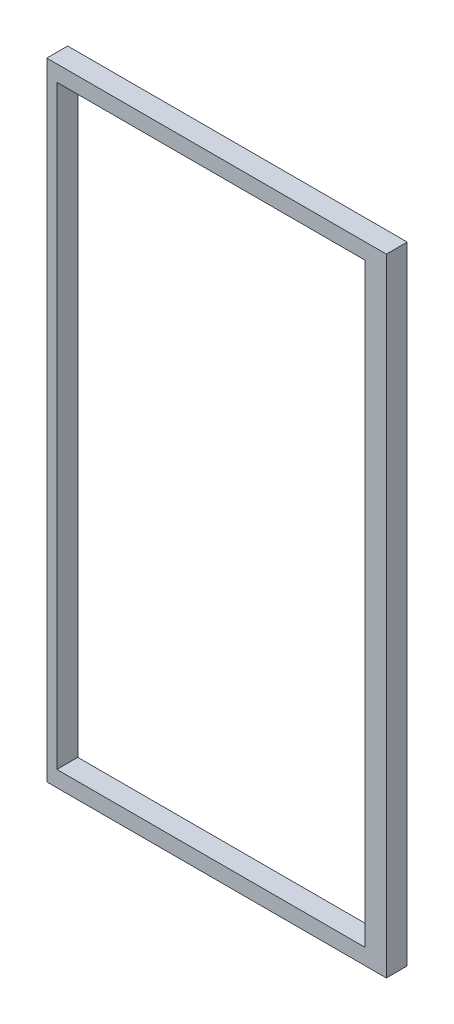
ISO-10303-21;
HEADER;
FILE_DESCRIPTION(('STEP AP214'),'2;1');
FILE_NAME('part.step','',(''),(''),'','','');
FILE_SCHEMA(('AUTOMOTIVE_DESIGN { 1 0 10303 214 1 1 1 1 }'));
ENDSEC;
DATA;
#1=APPLICATION_CONTEXT('core data for automotive mechanical design processes');
#2=APPLICATION_PROTOCOL_DEFINITION('international standard','automotive_design',2000,#1);
#3=PRODUCT_CONTEXT('',#1,'mechanical');
#4=PRODUCT('Part','Part','',(#3));
#5=PRODUCT_RELATED_PRODUCT_CATEGORY('part','',(#4));
#6=PRODUCT_DEFINITION_FORMATION('','',#4);
#7=PRODUCT_DEFINITION_CONTEXT('part definition',#1,'design');
#8=PRODUCT_DEFINITION('design','',#6,#7);
#9=PRODUCT_DEFINITION_SHAPE('','',#8);
#10=(LENGTH_UNIT() NAMED_UNIT(*) SI_UNIT(.MILLI.,.METRE.));
#11=(NAMED_UNIT(*) PLANE_ANGLE_UNIT() SI_UNIT($,.RADIAN.));
#12=(NAMED_UNIT(*) SI_UNIT($,.STERADIAN.) SOLID_ANGLE_UNIT());
#13=UNCERTAINTY_MEASURE_WITH_UNIT(LENGTH_MEASURE(1.E-05),#10,'distance_accuracy_value','');
#14=(GEOMETRIC_REPRESENTATION_CONTEXT(3) GLOBAL_UNCERTAINTY_ASSIGNED_CONTEXT((#13)) GLOBAL_UNIT_ASSIGNED_CONTEXT((#10,
#11,#12)) REPRESENTATION_CONTEXT('',''));
#15=CARTESIAN_POINT('',(0.,0.,0.));
#16=DIRECTION('',(0.,0.,1.));
#17=DIRECTION('',(1.,0.,0.));
#18=AXIS2_PLACEMENT_3D('',#15,#16,#17);
#19=CARTESIAN_POINT('',(0.,0.,4.));
#20=DIRECTION('',(0.,0.,1.));
#21=DIRECTION('',(1.,0.,0.));
#22=AXIS2_PLACEMENT_3D('',#19,#20,#21);
#23=PLANE('',#22);
#24=DIRECTION('',(0.,1.,0.));
#25=VECTOR('',#24,1.);
#26=CARTESIAN_POINT('',(43.7095883989414,60.,4.));
#27=LINE('',#26,#25);
#28=CARTESIAN_POINT('',(43.7095883989414,-60.,4.));
#29=VERTEX_POINT('',#28);
#30=CARTESIAN_POINT('',(43.7095883989414,60.,4.));
#31=VERTEX_POINT('',#30);
#32=EDGE_CURVE('E133',#29,#31,#27,.T.);
#33=ORIENTED_EDGE('',*,*,#32,.T.);
#34=DIRECTION('',(-1.,0.,0.));
#35=VECTOR('',#34,1.);
#36=CARTESIAN_POINT('',(-21.2904116010586,60.,4.));
#37=LINE('',#36,#35);
#38=CARTESIAN_POINT('',(-21.2904116010586,60.,4.));
#39=VERTEX_POINT('',#38);
#40=EDGE_CURVE('E136',#31,#39,#37,.T.);
#41=ORIENTED_EDGE('',*,*,#40,.T.);
#42=DIRECTION('',(0.,-1.,0.));
#43=VECTOR('',#42,1.);
#44=CARTESIAN_POINT('',(-21.2904116010586,60.,4.));
#45=LINE('',#44,#43);
#46=CARTESIAN_POINT('',(-21.2904116010586,-60.,4.));
#47=VERTEX_POINT('',#46);
#48=EDGE_CURVE('E139',#39,#47,#45,.T.);
#49=ORIENTED_EDGE('',*,*,#48,.T.);
#50=DIRECTION('',(1.,0.,0.));
#51=VECTOR('',#50,1.);
#52=CARTESIAN_POINT('',(-21.2904116010586,-60.,4.));
#53=LINE('',#52,#51);
#54=EDGE_CURVE('E141',#47,#29,#53,.T.);
#55=ORIENTED_EDGE('',*,*,#54,.T.);
#56=EDGE_LOOP('',(#33,#41,#49,#55));
#57=FACE_BOUND('',#56,.T.);
#58=DIRECTION('',(-1.,0.,0.));
#59=VECTOR('',#58,1.);
#60=CARTESIAN_POINT('',(-19.3557754190556,56.955158845332,4.));
#61=LINE('',#60,#59);
#62=CARTESIAN_POINT('',(39.6442245809444,56.955158845332,4.));
#63=VERTEX_POINT('',#62);
#64=CARTESIAN_POINT('',(-19.3557754190556,56.955158845332,4.));
#65=VERTEX_POINT('',#64);
#66=EDGE_CURVE('E105',#63,#65,#61,.T.);
#67=ORIENTED_EDGE('',*,*,#66,.F.);
#68=DIRECTION('',(0.,1.,0.));
#69=VECTOR('',#68,1.);
#70=CARTESIAN_POINT('',(39.6442245809444,56.955158845332,4.));
#71=LINE('',#70,#69);
#72=CARTESIAN_POINT('',(39.6442245809444,-56.9551588453319,4.));
#73=VERTEX_POINT('',#72);
#74=EDGE_CURVE('E97',#73,#63,#71,.T.);
#75=ORIENTED_EDGE('',*,*,#74,.F.);
#76=DIRECTION('',(1.,0.,0.));
#77=VECTOR('',#76,1.);
#78=CARTESIAN_POINT('',(-19.3557754190556,-56.9551588453319,4.));
#79=LINE('',#78,#77);
#80=CARTESIAN_POINT('',(-19.3557754190556,-56.9551588453319,4.));
#81=VERTEX_POINT('',#80);
#82=EDGE_CURVE('E119',#81,#73,#79,.T.);
#83=ORIENTED_EDGE('',*,*,#82,.F.);
#84=DIRECTION('',(0.,-1.,0.));
#85=VECTOR('',#84,1.);
#86=CARTESIAN_POINT('',(-19.3557754190556,56.955158845332,4.));
#87=LINE('',#86,#85);
#88=EDGE_CURVE('E117',#65,#81,#87,.T.);
#89=ORIENTED_EDGE('',*,*,#88,.F.);
#90=EDGE_LOOP('',(#67,#75,#83,#89));
#91=FACE_BOUND('',#90,.T.);
#92=ADVANCED_FACE('F32',(#57,#91),#23,.T.);
#93=CARTESIAN_POINT('',(0.,0.,0.));
#94=DIRECTION('',(0.,0.,1.));
#95=DIRECTION('',(1.,0.,0.));
#96=AXIS2_PLACEMENT_3D('',#93,#94,#95);
#97=PLANE('',#96);
#98=DIRECTION('',(0.,1.,0.));
#99=VECTOR('',#98,1.);
#100=CARTESIAN_POINT('',(43.7095883989414,60.,0.));
#101=LINE('',#100,#99);
#102=CARTESIAN_POINT('',(43.7095883989414,-60.,0.));
#103=VERTEX_POINT('',#102);
#104=CARTESIAN_POINT('',(43.7095883989414,60.,0.));
#105=VERTEX_POINT('',#104);
#106=EDGE_CURVE('E113',#103,#105,#101,.T.);
#107=ORIENTED_EDGE('',*,*,#106,.F.);
#108=DIRECTION('',(1.,0.,0.));
#109=VECTOR('',#108,1.);
#110=CARTESIAN_POINT('',(-21.2904116010586,-60.,0.));
#111=LINE('',#110,#109);
#112=CARTESIAN_POINT('',(-21.2904116010586,-60.,0.));
#113=VERTEX_POINT('',#112);
#114=EDGE_CURVE('E137',#113,#103,#111,.T.);
#115=ORIENTED_EDGE('',*,*,#114,.F.);
#116=DIRECTION('',(0.,-1.,0.));
#117=VECTOR('',#116,1.);
#118=CARTESIAN_POINT('',(-21.2904116010586,60.,0.));
#119=LINE('',#118,#117);
#120=CARTESIAN_POINT('',(-21.2904116010586,60.,0.));
#121=VERTEX_POINT('',#120);
#122=EDGE_CURVE('E148',#121,#113,#119,.T.);
#123=ORIENTED_EDGE('',*,*,#122,.F.);
#124=DIRECTION('',(-1.,0.,0.));
#125=VECTOR('',#124,1.);
#126=CARTESIAN_POINT('',(-21.2904116010586,60.,0.));
#127=LINE('',#126,#125);
#128=EDGE_CURVE('E146',#105,#121,#127,.T.);
#129=ORIENTED_EDGE('',*,*,#128,.F.);
#130=EDGE_LOOP('',(#107,#115,#123,#129));
#131=FACE_BOUND('',#130,.T.);
#132=DIRECTION('',(0.,1.,0.));
#133=VECTOR('',#132,1.);
#134=CARTESIAN_POINT('',(39.6442245809444,56.955158845332,0.));
#135=LINE('',#134,#133);
#136=CARTESIAN_POINT('',(39.6442245809444,-56.9551588453319,0.));
#137=VERTEX_POINT('',#136);
#138=CARTESIAN_POINT('',(39.6442245809444,56.955158845332,0.));
#139=VERTEX_POINT('',#138);
#140=EDGE_CURVE('E55',#137,#139,#135,.T.);
#141=ORIENTED_EDGE('',*,*,#140,.T.);
#142=DIRECTION('',(-1.,0.,0.));
#143=VECTOR('',#142,1.);
#144=CARTESIAN_POINT('',(-19.3557754190556,56.955158845332,0.));
#145=LINE('',#144,#143);
#146=CARTESIAN_POINT('',(-19.3557754190556,56.955158845332,0.));
#147=VERTEX_POINT('',#146);
#148=EDGE_CURVE('E112',#139,#147,#145,.T.);
#149=ORIENTED_EDGE('',*,*,#148,.T.);
#150=DIRECTION('',(0.,-1.,0.));
#151=VECTOR('',#150,1.);
#152=CARTESIAN_POINT('',(-19.3557754190556,56.955158845332,0.));
#153=LINE('',#152,#151);
#154=CARTESIAN_POINT('',(-19.3557754190556,-56.9551588453319,0.));
#155=VERTEX_POINT('',#154);
#156=EDGE_CURVE('E125',#147,#155,#153,.T.);
#157=ORIENTED_EDGE('',*,*,#156,.T.);
#158=DIRECTION('',(1.,0.,0.));
#159=VECTOR('',#158,1.);
#160=CARTESIAN_POINT('',(-19.3557754190556,-56.9551588453319,0.));
#161=LINE('',#160,#159);
#162=EDGE_CURVE('E106',#155,#137,#161,.T.);
#163=ORIENTED_EDGE('',*,*,#162,.T.);
#164=EDGE_LOOP('',(#141,#149,#157,#163));
#165=FACE_BOUND('',#164,.T.);
#166=ADVANCED_FACE('F166',(#131,#165),#97,.F.);
#167=CARTESIAN_POINT('',(43.7095883989414,60.,4.));
#168=DIRECTION('',(-1.,0.,0.));
#169=DIRECTION('',(0.,-1.,0.));
#170=AXIS2_PLACEMENT_3D('',#167,#168,#169);
#171=PLANE('',#170);
#172=ORIENTED_EDGE('',*,*,#106,.T.);
#173=DIRECTION('',(0.,0.,-1.));
#174=VECTOR('',#173,1.);
#175=CARTESIAN_POINT('',(43.7095883989414,60.,4.));
#176=LINE('',#175,#174);
#177=EDGE_CURVE('E11',#31,#105,#176,.T.);
#178=ORIENTED_EDGE('',*,*,#177,.F.);
#179=ORIENTED_EDGE('',*,*,#32,.F.);
#180=DIRECTION('',(0.,0.,-1.));
#181=VECTOR('',#180,1.);
#182=CARTESIAN_POINT('',(43.7095883989414,-60.,4.));
#183=LINE('',#182,#181);
#184=EDGE_CURVE('E143',#29,#103,#183,.T.);
#185=ORIENTED_EDGE('',*,*,#184,.T.);
#186=EDGE_LOOP('',(#172,#178,#179,#185));
#187=FACE_BOUND('',#186,.T.);
#188=ADVANCED_FACE('F34',(#187),#171,.F.);
#189=CARTESIAN_POINT('',(-21.2904116010586,60.,4.));
#190=DIRECTION('',(0.,-1.,0.));
#191=DIRECTION('',(0.,0.,-1.));
#192=AXIS2_PLACEMENT_3D('',#189,#190,#191);
#193=PLANE('',#192);
#194=ORIENTED_EDGE('',*,*,#128,.T.);
#195=DIRECTION('',(0.,0.,-1.));
#196=VECTOR('',#195,1.);
#197=CARTESIAN_POINT('',(-21.2904116010586,60.,4.));
#198=LINE('',#197,#196);
#199=EDGE_CURVE('E40',#39,#121,#198,.T.);
#200=ORIENTED_EDGE('',*,*,#199,.F.);
#201=ORIENTED_EDGE('',*,*,#40,.F.);
#202=ORIENTED_EDGE('',*,*,#177,.T.);
#203=EDGE_LOOP('',(#194,#200,#201,#202));
#204=FACE_BOUND('',#203,.T.);
#205=ADVANCED_FACE('F176',(#204),#193,.F.);
#206=CARTESIAN_POINT('',(-21.2904116010586,60.,4.));
#207=DIRECTION('',(1.,0.,0.));
#208=DIRECTION('',(0.,0.,-1.));
#209=AXIS2_PLACEMENT_3D('',#206,#207,#208);
#210=PLANE('',#209);
#211=ORIENTED_EDGE('',*,*,#122,.T.);
#212=DIRECTION('',(0.,0.,-1.));
#213=VECTOR('',#212,1.);
#214=CARTESIAN_POINT('',(-21.2904116010586,-60.,4.));
#215=LINE('',#214,#213);
#216=EDGE_CURVE('E153',#47,#113,#215,.T.);
#217=ORIENTED_EDGE('',*,*,#216,.F.);
#218=ORIENTED_EDGE('',*,*,#48,.F.);
#219=ORIENTED_EDGE('',*,*,#199,.T.);
#220=EDGE_LOOP('',(#211,#217,#218,#219));
#221=FACE_BOUND('',#220,.T.);
#222=ADVANCED_FACE('F160',(#221),#210,.F.);
#223=CARTESIAN_POINT('',(-21.2904116010586,-60.,4.));
#224=DIRECTION('',(0.,1.,0.));
#225=DIRECTION('',(0.,0.,1.));
#226=AXIS2_PLACEMENT_3D('',#223,#224,#225);
#227=PLANE('',#226);
#228=ORIENTED_EDGE('',*,*,#114,.T.);
#229=ORIENTED_EDGE('',*,*,#184,.F.);
#230=ORIENTED_EDGE('',*,*,#54,.F.);
#231=ORIENTED_EDGE('',*,*,#216,.T.);
#232=EDGE_LOOP('',(#228,#229,#230,#231));
#233=FACE_BOUND('',#232,.T.);
#234=ADVANCED_FACE('F170',(#233),#227,.F.);
#235=CARTESIAN_POINT('',(39.6442245809444,56.955158845332,4.));
#236=DIRECTION('',(-1.,0.,0.));
#237=DIRECTION('',(0.,-1.,0.));
#238=AXIS2_PLACEMENT_3D('',#235,#236,#237);
#239=PLANE('',#238);
#240=ORIENTED_EDGE('',*,*,#140,.F.);
#241=DIRECTION('',(0.,0.,-1.));
#242=VECTOR('',#241,1.);
#243=CARTESIAN_POINT('',(39.6442245809444,-56.9551588453319,4.));
#244=LINE('',#243,#242);
#245=EDGE_CURVE('E101',#73,#137,#244,.T.);
#246=ORIENTED_EDGE('',*,*,#245,.F.);
#247=ORIENTED_EDGE('',*,*,#74,.T.);
#248=DIRECTION('',(0.,0.,-1.));
#249=VECTOR('',#248,1.);
#250=CARTESIAN_POINT('',(39.6442245809444,56.955158845332,4.));
#251=LINE('',#250,#249);
#252=EDGE_CURVE('E100',#63,#139,#251,.T.);
#253=ORIENTED_EDGE('',*,*,#252,.T.);
#254=EDGE_LOOP('',(#240,#246,#247,#253));
#255=FACE_BOUND('',#254,.T.);
#256=ADVANCED_FACE('F99',(#255),#239,.T.);
#257=CARTESIAN_POINT('',(-19.3557754190556,56.955158845332,4.));
#258=DIRECTION('',(0.,-1.,0.));
#259=DIRECTION('',(0.,0.,-1.));
#260=AXIS2_PLACEMENT_3D('',#257,#258,#259);
#261=PLANE('',#260);
#262=ORIENTED_EDGE('',*,*,#148,.F.);
#263=ORIENTED_EDGE('',*,*,#252,.F.);
#264=ORIENTED_EDGE('',*,*,#66,.T.);
#265=DIRECTION('',(0.,0.,-1.));
#266=VECTOR('',#265,1.);
#267=CARTESIAN_POINT('',(-19.3557754190556,56.955158845332,4.));
#268=LINE('',#267,#266);
#269=EDGE_CURVE('E114',#65,#147,#268,.T.);
#270=ORIENTED_EDGE('',*,*,#269,.T.);
#271=EDGE_LOOP('',(#262,#263,#264,#270));
#272=FACE_BOUND('',#271,.T.);
#273=ADVANCED_FACE('F109',(#272),#261,.T.);
#274=CARTESIAN_POINT('',(-19.3557754190556,56.955158845332,4.));
#275=DIRECTION('',(1.,0.,0.));
#276=DIRECTION('',(0.,1.,0.));
#277=AXIS2_PLACEMENT_3D('',#274,#275,#276);
#278=PLANE('',#277);
#279=ORIENTED_EDGE('',*,*,#156,.F.);
#280=ORIENTED_EDGE('',*,*,#269,.F.);
#281=ORIENTED_EDGE('',*,*,#88,.T.);
#282=DIRECTION('',(0.,0.,-1.));
#283=VECTOR('',#282,1.);
#284=CARTESIAN_POINT('',(-19.3557754190556,-56.9551588453319,4.));
#285=LINE('',#284,#283);
#286=EDGE_CURVE('E47',#81,#155,#285,.T.);
#287=ORIENTED_EDGE('',*,*,#286,.T.);
#288=EDGE_LOOP('',(#279,#280,#281,#287));
#289=FACE_BOUND('',#288,.T.);
#290=ADVANCED_FACE('F199',(#289),#278,.T.);
#291=CARTESIAN_POINT('',(-19.3557754190556,-56.9551588453319,4.));
#292=DIRECTION('',(0.,1.,0.));
#293=DIRECTION('',(0.,0.,1.));
#294=AXIS2_PLACEMENT_3D('',#291,#292,#293);
#295=PLANE('',#294);
#296=ORIENTED_EDGE('',*,*,#162,.F.);
#297=ORIENTED_EDGE('',*,*,#286,.F.);
#298=ORIENTED_EDGE('',*,*,#82,.T.);
#299=ORIENTED_EDGE('',*,*,#245,.T.);
#300=EDGE_LOOP('',(#296,#297,#298,#299));
#301=FACE_BOUND('',#300,.T.);
#302=ADVANCED_FACE('F203',(#301),#295,.T.);
#303=CLOSED_SHELL('',(#92,#166,#188,#205,#222,#234,#256,#273,#290,#302));
#304=MANIFOLD_SOLID_BREP('B2',#303);
#305=ADVANCED_BREP_SHAPE_REPRESENTATION('',(#18,#304),#14);
#306=SHAPE_DEFINITION_REPRESENTATION(#9,#305);
ENDSEC;
END-ISO-10303-21;
